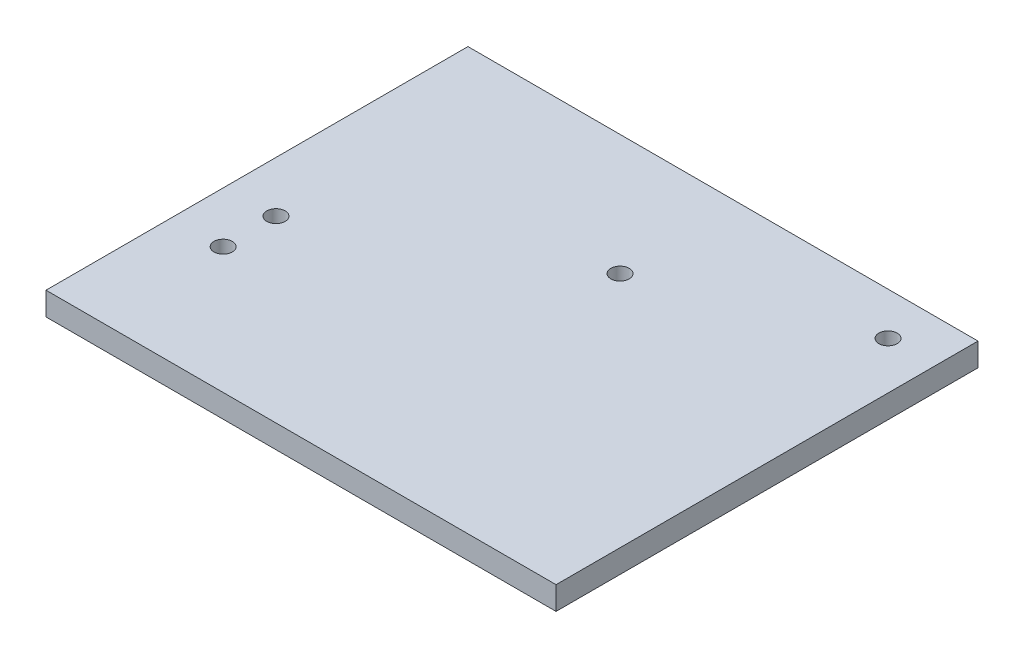
ISO-10303-21;
HEADER;
FILE_DESCRIPTION(('STEP AP214'),'2;1');
FILE_NAME('part.step','',(''),(''),'','','');
FILE_SCHEMA(('AUTOMOTIVE_DESIGN { 1 0 10303 214 1 1 1 1 }'));
ENDSEC;
DATA;
#1=APPLICATION_CONTEXT('core data for automotive mechanical design processes');
#2=APPLICATION_PROTOCOL_DEFINITION('international standard','automotive_design',2000,#1);
#3=PRODUCT_CONTEXT('',#1,'mechanical');
#4=PRODUCT('Part','Part','',(#3));
#5=PRODUCT_RELATED_PRODUCT_CATEGORY('part','',(#4));
#6=PRODUCT_DEFINITION_FORMATION('','',#4);
#7=PRODUCT_DEFINITION_CONTEXT('part definition',#1,'design');
#8=PRODUCT_DEFINITION('design','',#6,#7);
#9=PRODUCT_DEFINITION_SHAPE('','',#8);
#10=(LENGTH_UNIT() NAMED_UNIT(*) SI_UNIT(.MILLI.,.METRE.));
#11=(NAMED_UNIT(*) PLANE_ANGLE_UNIT() SI_UNIT($,.RADIAN.));
#12=(NAMED_UNIT(*) SI_UNIT($,.STERADIAN.) SOLID_ANGLE_UNIT());
#13=UNCERTAINTY_MEASURE_WITH_UNIT(LENGTH_MEASURE(1.E-05),#10,'distance_accuracy_value','');
#14=(GEOMETRIC_REPRESENTATION_CONTEXT(3) GLOBAL_UNCERTAINTY_ASSIGNED_CONTEXT((#13)) GLOBAL_UNIT_ASSIGNED_CONTEXT((#10,
#11,#12)) REPRESENTATION_CONTEXT('',''));
#15=CARTESIAN_POINT('',(0.,0.,0.));
#16=DIRECTION('',(0.,0.,1.));
#17=DIRECTION('',(1.,0.,0.));
#18=AXIS2_PLACEMENT_3D('',#15,#16,#17);
#19=CARTESIAN_POINT('',(55.,5.,0.));
#20=DIRECTION('',(1.,0.,0.));
#21=DIRECTION('',(0.,0.,-1.));
#22=AXIS2_PLACEMENT_3D('',#19,#20,#21);
#23=PLANE('',#22);
#24=DIRECTION('',(0.,0.,1.));
#25=VECTOR('',#24,1.);
#26=CARTESIAN_POINT('',(55.,0.,0.));
#27=LINE('',#26,#25);
#28=CARTESIAN_POINT('',(55.,0.,-45.5));
#29=VERTEX_POINT('',#28);
#30=CARTESIAN_POINT('',(55.,0.,45.5));
#31=VERTEX_POINT('',#30);
#32=EDGE_CURVE('E129',#29,#31,#27,.T.);
#33=ORIENTED_EDGE('',*,*,#32,.F.);
#34=DIRECTION('',(0.,-1.,0.));
#35=VECTOR('',#34,1.);
#36=CARTESIAN_POINT('',(55.,5.,-45.5));
#37=LINE('',#36,#35);
#38=CARTESIAN_POINT('',(55.,5.,-45.5));
#39=VERTEX_POINT('',#38);
#40=EDGE_CURVE('E11',#39,#29,#37,.T.);
#41=ORIENTED_EDGE('',*,*,#40,.F.);
#42=DIRECTION('',(0.,0.,1.));
#43=VECTOR('',#42,1.);
#44=CARTESIAN_POINT('',(55.,5.,0.));
#45=LINE('',#44,#43);
#46=CARTESIAN_POINT('',(55.,5.,45.5));
#47=VERTEX_POINT('',#46);
#48=EDGE_CURVE('E103',#39,#47,#45,.T.);
#49=ORIENTED_EDGE('',*,*,#48,.T.);
#50=DIRECTION('',(0.,-1.,0.));
#51=VECTOR('',#50,1.);
#52=CARTESIAN_POINT('',(55.,5.,45.5));
#53=LINE('',#52,#51);
#54=EDGE_CURVE('E80',#47,#31,#53,.T.);
#55=ORIENTED_EDGE('',*,*,#54,.T.);
#56=EDGE_LOOP('',(#33,#41,#49,#55));
#57=FACE_BOUND('',#56,.T.);
#58=ADVANCED_FACE('F39',(#57),#23,.T.);
#59=CARTESIAN_POINT('',(0.,5.,-45.5));
#60=DIRECTION('',(0.,0.,-1.));
#61=DIRECTION('',(-1.,0.,0.));
#62=AXIS2_PLACEMENT_3D('',#59,#60,#61);
#63=PLANE('',#62);
#64=DIRECTION('',(1.,0.,0.));
#65=VECTOR('',#64,1.);
#66=CARTESIAN_POINT('',(0.,0.,-45.5));
#67=LINE('',#66,#65);
#68=CARTESIAN_POINT('',(-55.,0.,-45.5));
#69=VERTEX_POINT('',#68);
#70=EDGE_CURVE('E92',#69,#29,#67,.T.);
#71=ORIENTED_EDGE('',*,*,#70,.F.);
#72=DIRECTION('',(0.,-1.,0.));
#73=VECTOR('',#72,1.);
#74=CARTESIAN_POINT('',(-55.,5.,-45.5));
#75=LINE('',#74,#73);
#76=CARTESIAN_POINT('',(-55.,5.,-45.5));
#77=VERTEX_POINT('',#76);
#78=EDGE_CURVE('E49',#77,#69,#75,.T.);
#79=ORIENTED_EDGE('',*,*,#78,.F.);
#80=DIRECTION('',(1.,0.,0.));
#81=VECTOR('',#80,1.);
#82=CARTESIAN_POINT('',(0.,5.,-45.5));
#83=LINE('',#82,#81);
#84=EDGE_CURVE('E90',#77,#39,#83,.T.);
#85=ORIENTED_EDGE('',*,*,#84,.T.);
#86=ORIENTED_EDGE('',*,*,#40,.T.);
#87=EDGE_LOOP('',(#71,#79,#85,#86));
#88=FACE_BOUND('',#87,.T.);
#89=ADVANCED_FACE('F88',(#88),#63,.T.);
#90=CARTESIAN_POINT('',(-55.,5.,0.));
#91=DIRECTION('',(1.,0.,0.));
#92=DIRECTION('',(0.,0.,-1.));
#93=AXIS2_PLACEMENT_3D('',#90,#91,#92);
#94=PLANE('',#93);
#95=DIRECTION('',(0.,0.,1.));
#96=VECTOR('',#95,1.);
#97=CARTESIAN_POINT('',(-55.,0.,0.));
#98=LINE('',#97,#96);
#99=CARTESIAN_POINT('',(-55.,0.,45.5));
#100=VERTEX_POINT('',#99);
#101=EDGE_CURVE('E134',#69,#100,#98,.T.);
#102=ORIENTED_EDGE('',*,*,#101,.T.);
#103=DIRECTION('',(0.,-1.,0.));
#104=VECTOR('',#103,1.);
#105=CARTESIAN_POINT('',(-55.,5.,45.5));
#106=LINE('',#105,#104);
#107=CARTESIAN_POINT('',(-55.,5.,45.5));
#108=VERTEX_POINT('',#107);
#109=EDGE_CURVE('E96',#108,#100,#106,.T.);
#110=ORIENTED_EDGE('',*,*,#109,.F.);
#111=DIRECTION('',(0.,0.,1.));
#112=VECTOR('',#111,1.);
#113=CARTESIAN_POINT('',(-55.,5.,0.));
#114=LINE('',#113,#112);
#115=EDGE_CURVE('E98',#77,#108,#114,.T.);
#116=ORIENTED_EDGE('',*,*,#115,.F.);
#117=ORIENTED_EDGE('',*,*,#78,.T.);
#118=EDGE_LOOP('',(#102,#110,#116,#117));
#119=FACE_BOUND('',#118,.T.);
#120=ADVANCED_FACE('F99',(#119),#94,.F.);
#121=CARTESIAN_POINT('',(-44.025,5.,18.275));
#122=DIRECTION('',(0.,-1.,0.));
#123=DIRECTION('',(0.,0.,-1.));
#124=AXIS2_PLACEMENT_3D('',#121,#122,#123);
#125=CYLINDRICAL_SURFACE('',#124,1.98);
#126=CARTESIAN_POINT('',(-44.025,5.,18.275));
#127=DIRECTION('',(0.,1.,0.));
#128=DIRECTION('',(0.,0.,1.));
#129=AXIS2_PLACEMENT_3D('',#126,#127,#128);
#130=CIRCLE('',#129,1.98);
#131=CARTESIAN_POINT('',(-44.025,5.,20.255));
#132=VERTEX_POINT('',#131);
#133=EDGE_CURVE('E107',#132,#132,#130,.T.);
#134=ORIENTED_EDGE('',*,*,#133,.T.);
#135=EDGE_LOOP('',(#134));
#136=FACE_BOUND('',#135,.T.);
#137=CARTESIAN_POINT('',(-44.025,0.,18.275));
#138=DIRECTION('',(0.,1.,0.));
#139=DIRECTION('',(0.,0.,1.));
#140=AXIS2_PLACEMENT_3D('',#137,#138,#139);
#141=CIRCLE('',#140,1.98);
#142=CARTESIAN_POINT('',(-44.025,0.,20.255));
#143=VERTEX_POINT('',#142);
#144=EDGE_CURVE('E125',#143,#143,#141,.T.);
#145=ORIENTED_EDGE('',*,*,#144,.F.);
#146=EDGE_LOOP('',(#145));
#147=FACE_BOUND('',#146,.T.);
#148=ADVANCED_FACE('F154',(#136,#147),#125,.F.);
#149=CARTESIAN_POINT('',(-44.025,5.,6.87500000000001));
#150=DIRECTION('',(0.,-1.,0.));
#151=DIRECTION('',(0.,0.,-1.));
#152=AXIS2_PLACEMENT_3D('',#149,#150,#151);
#153=CYLINDRICAL_SURFACE('',#152,1.98);
#154=CARTESIAN_POINT('',(-44.025,5.,6.87500000000001));
#155=DIRECTION('',(0.,1.,0.));
#156=DIRECTION('',(0.,0.,1.));
#157=AXIS2_PLACEMENT_3D('',#154,#155,#156);
#158=CIRCLE('',#157,1.98);
#159=CARTESIAN_POINT('',(-44.025,5.,8.85500000000001));
#160=VERTEX_POINT('',#159);
#161=EDGE_CURVE('E254',#160,#160,#158,.T.);
#162=ORIENTED_EDGE('',*,*,#161,.T.);
#163=EDGE_LOOP('',(#162));
#164=FACE_BOUND('',#163,.T.);
#165=CARTESIAN_POINT('',(-44.025,0.,6.87500000000001));
#166=DIRECTION('',(0.,1.,0.));
#167=DIRECTION('',(0.,0.,1.));
#168=AXIS2_PLACEMENT_3D('',#165,#166,#167);
#169=CIRCLE('',#168,1.98);
#170=CARTESIAN_POINT('',(-44.025,0.,8.85500000000001));
#171=VERTEX_POINT('',#170);
#172=EDGE_CURVE('E121',#171,#171,#169,.T.);
#173=ORIENTED_EDGE('',*,*,#172,.F.);
#174=EDGE_LOOP('',(#173));
#175=FACE_BOUND('',#174,.T.);
#176=ADVANCED_FACE('F157',(#164,#175),#153,.F.);
#177=CARTESIAN_POINT('',(3.8,5.,-19.5));
#178=DIRECTION('',(0.,-1.,0.));
#179=DIRECTION('',(0.,0.,-1.));
#180=AXIS2_PLACEMENT_3D('',#177,#178,#179);
#181=CYLINDRICAL_SURFACE('',#180,1.98);
#182=CARTESIAN_POINT('',(3.8,5.,-19.5));
#183=DIRECTION('',(0.,1.,0.));
#184=DIRECTION('',(0.,0.,1.));
#185=AXIS2_PLACEMENT_3D('',#182,#183,#184);
#186=CIRCLE('',#185,1.98);
#187=CARTESIAN_POINT('',(3.8,5.,-17.52));
#188=VERTEX_POINT('',#187);
#189=EDGE_CURVE('E171',#188,#188,#186,.T.);
#190=ORIENTED_EDGE('',*,*,#189,.T.);
#191=EDGE_LOOP('',(#190));
#192=FACE_BOUND('',#191,.T.);
#193=CARTESIAN_POINT('',(3.8,0.,-19.5));
#194=DIRECTION('',(0.,1.,0.));
#195=DIRECTION('',(0.,0.,1.));
#196=AXIS2_PLACEMENT_3D('',#193,#194,#195);
#197=CIRCLE('',#196,1.98);
#198=CARTESIAN_POINT('',(3.8,0.,-17.52));
#199=VERTEX_POINT('',#198);
#200=EDGE_CURVE('E117',#199,#199,#197,.T.);
#201=ORIENTED_EDGE('',*,*,#200,.F.);
#202=EDGE_LOOP('',(#201));
#203=FACE_BOUND('',#202,.T.);
#204=ADVANCED_FACE('F160',(#192,#203),#181,.F.);
#205=CARTESIAN_POINT('',(44.8,5.,-36.3));
#206=DIRECTION('',(0.,-1.,0.));
#207=DIRECTION('',(0.,0.,-1.));
#208=AXIS2_PLACEMENT_3D('',#205,#206,#207);
#209=CYLINDRICAL_SURFACE('',#208,1.98);
#210=CARTESIAN_POINT('',(44.8,5.,-36.3));
#211=DIRECTION('',(0.,1.,0.));
#212=DIRECTION('',(0.,0.,1.));
#213=AXIS2_PLACEMENT_3D('',#210,#211,#212);
#214=CIRCLE('',#213,1.98);
#215=CARTESIAN_POINT('',(44.8,5.,-34.32));
#216=VERTEX_POINT('',#215);
#217=EDGE_CURVE('E139',#216,#216,#214,.T.);
#218=ORIENTED_EDGE('',*,*,#217,.T.);
#219=EDGE_LOOP('',(#218));
#220=FACE_BOUND('',#219,.T.);
#221=CARTESIAN_POINT('',(44.8,0.,-36.3));
#222=DIRECTION('',(0.,1.,0.));
#223=DIRECTION('',(0.,0.,1.));
#224=AXIS2_PLACEMENT_3D('',#221,#222,#223);
#225=CIRCLE('',#224,1.98);
#226=CARTESIAN_POINT('',(44.8,0.,-34.32));
#227=VERTEX_POINT('',#226);
#228=EDGE_CURVE('E113',#227,#227,#225,.T.);
#229=ORIENTED_EDGE('',*,*,#228,.F.);
#230=EDGE_LOOP('',(#229));
#231=FACE_BOUND('',#230,.T.);
#232=ADVANCED_FACE('F41',(#220,#231),#209,.F.);
#233=CARTESIAN_POINT('',(0.,5.,45.5));
#234=DIRECTION('',(0.,0.,-1.));
#235=DIRECTION('',(-1.,0.,0.));
#236=AXIS2_PLACEMENT_3D('',#233,#234,#235);
#237=PLANE('',#236);
#238=DIRECTION('',(1.,0.,0.));
#239=VECTOR('',#238,1.);
#240=CARTESIAN_POINT('',(0.,0.,45.5));
#241=LINE('',#240,#239);
#242=EDGE_CURVE('E73',#100,#31,#241,.T.);
#243=ORIENTED_EDGE('',*,*,#242,.T.);
#244=ORIENTED_EDGE('',*,*,#54,.F.);
#245=DIRECTION('',(1.,0.,0.));
#246=VECTOR('',#245,1.);
#247=CARTESIAN_POINT('',(0.,5.,45.5));
#248=LINE('',#247,#246);
#249=EDGE_CURVE('E57',#108,#47,#248,.T.);
#250=ORIENTED_EDGE('',*,*,#249,.F.);
#251=ORIENTED_EDGE('',*,*,#109,.T.);
#252=EDGE_LOOP('',(#243,#244,#250,#251));
#253=FACE_BOUND('',#252,.T.);
#254=ADVANCED_FACE('F144',(#253),#237,.F.);
#255=CARTESIAN_POINT('',(0.,5.,0.));
#256=DIRECTION('',(0.,1.,0.));
#257=DIRECTION('',(0.,0.,1.));
#258=AXIS2_PLACEMENT_3D('',#255,#256,#257);
#259=PLANE('',#258);
#260=ORIENTED_EDGE('',*,*,#217,.F.);
#261=EDGE_LOOP('',(#260));
#262=FACE_BOUND('',#261,.T.);
#263=ORIENTED_EDGE('',*,*,#189,.F.);
#264=EDGE_LOOP('',(#263));
#265=FACE_BOUND('',#264,.T.);
#266=ORIENTED_EDGE('',*,*,#161,.F.);
#267=EDGE_LOOP('',(#266));
#268=FACE_BOUND('',#267,.T.);
#269=ORIENTED_EDGE('',*,*,#133,.F.);
#270=EDGE_LOOP('',(#269));
#271=FACE_BOUND('',#270,.T.);
#272=ORIENTED_EDGE('',*,*,#48,.F.);
#273=ORIENTED_EDGE('',*,*,#84,.F.);
#274=ORIENTED_EDGE('',*,*,#115,.T.);
#275=ORIENTED_EDGE('',*,*,#249,.T.);
#276=EDGE_LOOP('',(#272,#273,#274,#275));
#277=FACE_BOUND('',#276,.T.);
#278=ADVANCED_FACE('F102',(#262,#265,#268,#271,#277),#259,.T.);
#279=CARTESIAN_POINT('',(0.,0.,0.));
#280=DIRECTION('',(0.,1.,0.));
#281=DIRECTION('',(0.,0.,1.));
#282=AXIS2_PLACEMENT_3D('',#279,#280,#281);
#283=PLANE('',#282);
#284=ORIENTED_EDGE('',*,*,#228,.T.);
#285=EDGE_LOOP('',(#284));
#286=FACE_BOUND('',#285,.T.);
#287=ORIENTED_EDGE('',*,*,#200,.T.);
#288=EDGE_LOOP('',(#287));
#289=FACE_BOUND('',#288,.T.);
#290=ORIENTED_EDGE('',*,*,#172,.T.);
#291=EDGE_LOOP('',(#290));
#292=FACE_BOUND('',#291,.T.);
#293=ORIENTED_EDGE('',*,*,#144,.T.);
#294=EDGE_LOOP('',(#293));
#295=FACE_BOUND('',#294,.T.);
#296=ORIENTED_EDGE('',*,*,#32,.T.);
#297=ORIENTED_EDGE('',*,*,#242,.F.);
#298=ORIENTED_EDGE('',*,*,#101,.F.);
#299=ORIENTED_EDGE('',*,*,#70,.T.);
#300=EDGE_LOOP('',(#296,#297,#298,#299));
#301=FACE_BOUND('',#300,.T.);
#302=ADVANCED_FACE('F145',(#286,#289,#292,#295,#301),#283,.F.);
#303=CLOSED_SHELL('',(#58,#89,#120,#148,#176,#204,#232,#254,#278,#302));
#304=MANIFOLD_SOLID_BREP('B2',#303);
#305=ADVANCED_BREP_SHAPE_REPRESENTATION('',(#18,#304),#14);
#306=SHAPE_DEFINITION_REPRESENTATION(#9,#305);
ENDSEC;
END-ISO-10303-21;
